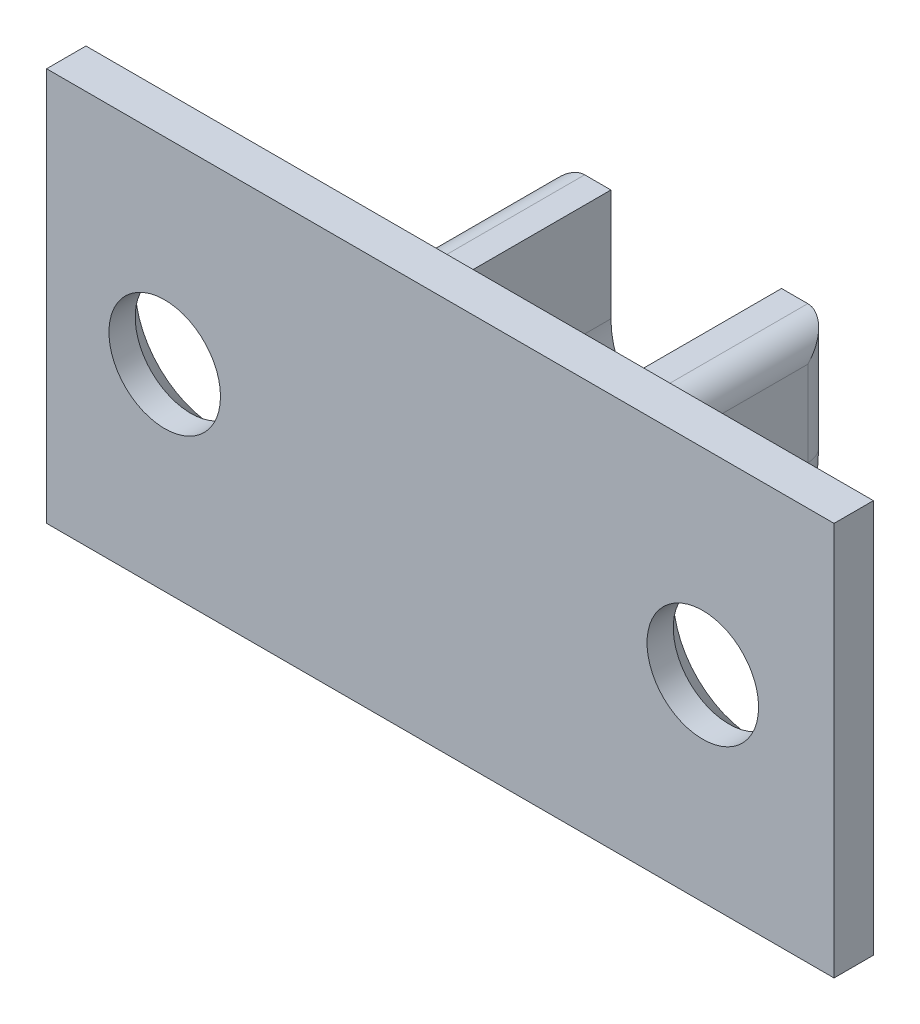
ISO-10303-21;
HEADER;
FILE_DESCRIPTION(('STEP AP214'),'2;1');
FILE_NAME('part.step','',(''),(''),'','','');
FILE_SCHEMA(('AUTOMOTIVE_DESIGN { 1 0 10303 214 1 1 1 1 }'));
ENDSEC;
DATA;
#1=APPLICATION_CONTEXT('core data for automotive mechanical design processes');
#2=APPLICATION_PROTOCOL_DEFINITION('international standard','automotive_design',2000,#1);
#3=PRODUCT_CONTEXT('',#1,'mechanical');
#4=PRODUCT('Part','Part','',(#3));
#5=PRODUCT_RELATED_PRODUCT_CATEGORY('part','',(#4));
#6=PRODUCT_DEFINITION_FORMATION('','',#4);
#7=PRODUCT_DEFINITION_CONTEXT('part definition',#1,'design');
#8=PRODUCT_DEFINITION('design','',#6,#7);
#9=PRODUCT_DEFINITION_SHAPE('','',#8);
#10=(LENGTH_UNIT() NAMED_UNIT(*) SI_UNIT(.MILLI.,.METRE.));
#11=(NAMED_UNIT(*) PLANE_ANGLE_UNIT() SI_UNIT($,.RADIAN.));
#12=(NAMED_UNIT(*) SI_UNIT($,.STERADIAN.) SOLID_ANGLE_UNIT());
#13=UNCERTAINTY_MEASURE_WITH_UNIT(LENGTH_MEASURE(1.E-05),#10,'distance_accuracy_value','');
#14=(GEOMETRIC_REPRESENTATION_CONTEXT(3) GLOBAL_UNCERTAINTY_ASSIGNED_CONTEXT((#13)) GLOBAL_UNIT_ASSIGNED_CONTEXT((#10,
#11,#12)) REPRESENTATION_CONTEXT('',''));
#15=CARTESIAN_POINT('',(0.,0.,0.));
#16=DIRECTION('',(0.,0.,1.));
#17=DIRECTION('',(1.,0.,0.));
#18=AXIS2_PLACEMENT_3D('',#15,#16,#17);
#19=CARTESIAN_POINT('',(0.,0.,0.));
#20=DIRECTION('',(0.,0.,1.));
#21=DIRECTION('',(1.,0.,0.));
#22=AXIS2_PLACEMENT_3D('',#19,#20,#21);
#23=PLANE('',#22);
#24=DIRECTION('',(-1.,0.,0.));
#25=VECTOR('',#24,1.);
#26=CARTESIAN_POINT('',(0.,0.500000000000004,0.));
#27=LINE('',#26,#25);
#28=CARTESIAN_POINT('',(30.,0.500000000000004,0.));
#29=VERTEX_POINT('',#28);
#30=CARTESIAN_POINT('',(0.500000000000004,0.500000000000004,0.));
#31=VERTEX_POINT('',#30);
#32=EDGE_CURVE('E383',#29,#31,#27,.T.);
#33=ORIENTED_EDGE('',*,*,#32,.T.);
#34=DIRECTION('',(0.,1.,0.));
#35=VECTOR('',#34,1.);
#36=CARTESIAN_POINT('',(0.500000000000004,15.,0.));
#37=LINE('',#36,#35);
#38=CARTESIAN_POINT('',(0.500000000000004,14.5,0.));
#39=VERTEX_POINT('',#38);
#40=EDGE_CURVE('E44',#31,#39,#37,.T.);
#41=ORIENTED_EDGE('',*,*,#40,.T.);
#42=DIRECTION('',(1.,0.,0.));
#43=VECTOR('',#42,1.);
#44=CARTESIAN_POINT('',(30.5,14.5,0.));
#45=LINE('',#44,#43);
#46=CARTESIAN_POINT('',(30.,14.5,0.));
#47=VERTEX_POINT('',#46);
#48=EDGE_CURVE('E60',#39,#47,#45,.T.);
#49=ORIENTED_EDGE('',*,*,#48,.T.);
#50=DIRECTION('',(0.,-1.,0.));
#51=VECTOR('',#50,1.);
#52=CARTESIAN_POINT('',(30.,0.,0.));
#53=LINE('',#52,#51);
#54=EDGE_CURVE('E385',#47,#29,#53,.T.);
#55=ORIENTED_EDGE('',*,*,#54,.T.);
#56=EDGE_LOOP('',(#33,#41,#49,#55));
#57=FACE_BOUND('',#56,.T.);
#58=CARTESIAN_POINT('',(5.,7.5,0.));
#59=DIRECTION('',(0.,0.,1.));
#60=DIRECTION('',(1.,0.,0.));
#61=AXIS2_PLACEMENT_3D('',#58,#59,#60);
#62=CIRCLE('',#61,3.12500000000001);
#63=CARTESIAN_POINT('',(8.12500000000001,7.5,0.));
#64=VERTEX_POINT('',#63);
#65=EDGE_CURVE('E354',#64,#64,#62,.T.);
#66=ORIENTED_EDGE('',*,*,#65,.T.);
#67=EDGE_LOOP('',(#66));
#68=FACE_BOUND('',#67,.T.);
#69=CARTESIAN_POINT('',(25.5,7.5,0.));
#70=DIRECTION('',(0.,0.,1.));
#71=DIRECTION('',(1.,0.,0.));
#72=AXIS2_PLACEMENT_3D('',#69,#70,#71);
#73=CIRCLE('',#72,3.12500000000002);
#74=CARTESIAN_POINT('',(28.625,7.5,0.));
#75=VERTEX_POINT('',#74);
#76=EDGE_CURVE('E318',#75,#75,#73,.T.);
#77=ORIENTED_EDGE('',*,*,#76,.T.);
#78=EDGE_LOOP('',(#77));
#79=FACE_BOUND('',#78,.T.);
#80=DIRECTION('',(1.,0.,0.));
#81=VECTOR('',#80,1.);
#82=CARTESIAN_POINT('',(18.5,12.75,0.));
#83=LINE('',#82,#81);
#84=CARTESIAN_POINT('',(19.5,12.75,0.));
#85=VERTEX_POINT('',#84);
#86=CARTESIAN_POINT('',(18.5,12.75,0.));
#87=VERTEX_POINT('',#86);
#88=EDGE_CURVE('E300',#85,#87,#83,.F.);
#89=ORIENTED_EDGE('',*,*,#88,.T.);
#90=DIRECTION('',(0.,1.,0.));
#91=VECTOR('',#90,1.);
#92=CARTESIAN_POINT('',(18.5,0.,0.));
#93=LINE('',#92,#91);
#94=CARTESIAN_POINT('',(18.5,7.5,0.));
#95=VERTEX_POINT('',#94);
#96=EDGE_CURVE('E233',#95,#87,#93,.T.);
#97=ORIENTED_EDGE('',*,*,#96,.F.);
#98=CARTESIAN_POINT('',(15.25,7.5,0.));
#99=DIRECTION('',(0.,0.,1.));
#100=DIRECTION('',(1.,0.,0.));
#101=AXIS2_PLACEMENT_3D('',#98,#99,#100);
#102=CIRCLE('',#101,3.25);
#103=CARTESIAN_POINT('',(12.,7.5,0.));
#104=VERTEX_POINT('',#103);
#105=EDGE_CURVE('E222',#104,#95,#102,.T.);
#106=ORIENTED_EDGE('',*,*,#105,.F.);
#107=DIRECTION('',(0.,1.,0.));
#108=VECTOR('',#107,1.);
#109=CARTESIAN_POINT('',(12.,0.,0.));
#110=LINE('',#109,#108);
#111=CARTESIAN_POINT('',(12.,12.75,0.));
#112=VERTEX_POINT('',#111);
#113=EDGE_CURVE('E220',#104,#112,#110,.T.);
#114=ORIENTED_EDGE('',*,*,#113,.T.);
#115=DIRECTION('',(-1.,0.,0.));
#116=VECTOR('',#115,1.);
#117=CARTESIAN_POINT('',(0.,12.75,0.));
#118=LINE('',#117,#116);
#119=CARTESIAN_POINT('',(11.,12.75,0.));
#120=VERTEX_POINT('',#119);
#121=EDGE_CURVE('E291',#112,#120,#118,.T.);
#122=ORIENTED_EDGE('',*,*,#121,.T.);
#123=CARTESIAN_POINT('',(11.,10.75,0.));
#124=DIRECTION('',(0.,0.,1.));
#125=DIRECTION('',(1.,0.,0.));
#126=AXIS2_PLACEMENT_3D('',#123,#124,#125);
#127=CIRCLE('',#126,2.);
#128=CARTESIAN_POINT('',(9.,10.75,0.));
#129=VERTEX_POINT('',#128);
#130=EDGE_CURVE('E288',#129,#120,#127,.F.);
#131=ORIENTED_EDGE('',*,*,#130,.F.);
#132=DIRECTION('',(0.,1.,0.));
#133=VECTOR('',#132,1.);
#134=CARTESIAN_POINT('',(9.,7.5,0.));
#135=LINE('',#134,#133);
#136=CARTESIAN_POINT('',(9.,7.5,0.));
#137=VERTEX_POINT('',#136);
#138=EDGE_CURVE('E286',#129,#137,#135,.F.);
#139=ORIENTED_EDGE('',*,*,#138,.T.);
#140=CARTESIAN_POINT('',(15.25,7.5,0.));
#141=DIRECTION('',(0.,0.,1.));
#142=DIRECTION('',(1.,0.,0.));
#143=AXIS2_PLACEMENT_3D('',#140,#141,#142);
#144=CIRCLE('',#143,6.25);
#145=CARTESIAN_POINT('',(21.5,7.5,0.));
#146=VERTEX_POINT('',#145);
#147=EDGE_CURVE('E293',#137,#146,#144,.T.);
#148=ORIENTED_EDGE('',*,*,#147,.T.);
#149=DIRECTION('',(0.,1.,0.));
#150=VECTOR('',#149,1.);
#151=CARTESIAN_POINT('',(21.5,0.,0.));
#152=LINE('',#151,#150);
#153=CARTESIAN_POINT('',(21.5,10.75,0.));
#154=VERTEX_POINT('',#153);
#155=EDGE_CURVE('E295',#146,#154,#152,.T.);
#156=ORIENTED_EDGE('',*,*,#155,.T.);
#157=CARTESIAN_POINT('',(19.5,10.75,0.));
#158=DIRECTION('',(0.,0.,1.));
#159=DIRECTION('',(1.,0.,0.));
#160=AXIS2_PLACEMENT_3D('',#157,#158,#159);
#161=CIRCLE('',#160,2.);
#162=EDGE_CURVE('E297',#85,#154,#161,.F.);
#163=ORIENTED_EDGE('',*,*,#162,.F.);
#164=EDGE_LOOP('',(#89,#97,#106,#114,#122,#131,#139,#148,#156,#163));
#165=FACE_BOUND('',#164,.T.);
#166=ADVANCED_FACE('F35',(#57,#68,#79,#165),#23,.F.);
#167=CARTESIAN_POINT('',(0.,0.,2.));
#168=DIRECTION('',(0.,1.,0.));
#169=DIRECTION('',(0.,0.,1.));
#170=AXIS2_PLACEMENT_3D('',#167,#168,#169);
#171=PLANE('',#170);
#172=DIRECTION('',(1.,0.,0.));
#173=VECTOR('',#172,1.);
#174=CARTESIAN_POINT('',(0.,0.,2.));
#175=LINE('',#174,#173);
#176=CARTESIAN_POINT('',(0.500000000000004,0.,2.));
#177=VERTEX_POINT('',#176);
#178=CARTESIAN_POINT('',(30.5,0.,2.));
#179=VERTEX_POINT('',#178);
#180=EDGE_CURVE('E240',#177,#179,#175,.T.);
#181=ORIENTED_EDGE('',*,*,#180,.F.);
#182=DIRECTION('',(0.,0.,-1.));
#183=VECTOR('',#182,1.);
#184=CARTESIAN_POINT('',(0.500000000000004,0.,0.));
#185=LINE('',#184,#183);
#186=CARTESIAN_POINT('',(0.500000000000004,0.,0.500000000000004));
#187=VERTEX_POINT('',#186);
#188=EDGE_CURVE('E381',#177,#187,#185,.T.);
#189=ORIENTED_EDGE('',*,*,#188,.T.);
#190=DIRECTION('',(1.,0.,0.));
#191=VECTOR('',#190,1.);
#192=CARTESIAN_POINT('',(0.,0.,0.500000000000004));
#193=LINE('',#192,#191);
#194=CARTESIAN_POINT('',(30.5,0.,0.500000000000004));
#195=VERTEX_POINT('',#194);
#196=EDGE_CURVE('E379',#187,#195,#193,.T.);
#197=ORIENTED_EDGE('',*,*,#196,.T.);
#198=DIRECTION('',(0.,0.,-1.));
#199=VECTOR('',#198,1.);
#200=CARTESIAN_POINT('',(30.5,0.,2.));
#201=LINE('',#200,#199);
#202=EDGE_CURVE('E263',#179,#195,#201,.T.);
#203=ORIENTED_EDGE('',*,*,#202,.F.);
#204=EDGE_LOOP('',(#181,#189,#197,#203));
#205=FACE_BOUND('',#204,.T.);
#206=ADVANCED_FACE('F453',(#205),#171,.F.);
#207=CARTESIAN_POINT('',(30.5,0.,2.));
#208=DIRECTION('',(-1.,0.,0.));
#209=DIRECTION('',(0.,0.,1.));
#210=AXIS2_PLACEMENT_3D('',#207,#208,#209);
#211=PLANE('',#210);
#212=ORIENTED_EDGE('',*,*,#202,.T.);
#213=DIRECTION('',(0.,1.,0.));
#214=VECTOR('',#213,1.);
#215=CARTESIAN_POINT('',(30.5,0.,0.500000000000004));
#216=LINE('',#215,#214);
#217=CARTESIAN_POINT('',(30.5,15.,0.500000000000004));
#218=VERTEX_POINT('',#217);
#219=EDGE_CURVE('E11',#195,#218,#216,.T.);
#220=ORIENTED_EDGE('',*,*,#219,.T.);
#221=DIRECTION('',(0.,0.,-1.));
#222=VECTOR('',#221,1.);
#223=CARTESIAN_POINT('',(30.5,15.,2.));
#224=LINE('',#223,#222);
#225=CARTESIAN_POINT('',(30.5,15.,2.));
#226=VERTEX_POINT('',#225);
#227=EDGE_CURVE('E260',#226,#218,#224,.T.);
#228=ORIENTED_EDGE('',*,*,#227,.F.);
#229=DIRECTION('',(0.,1.,0.));
#230=VECTOR('',#229,1.);
#231=CARTESIAN_POINT('',(30.5,0.,2.));
#232=LINE('',#231,#230);
#233=EDGE_CURVE('E249',#179,#226,#232,.T.);
#234=ORIENTED_EDGE('',*,*,#233,.F.);
#235=EDGE_LOOP('',(#212,#220,#228,#234));
#236=FACE_BOUND('',#235,.T.);
#237=ADVANCED_FACE('F441',(#236),#211,.F.);
#238=CARTESIAN_POINT('',(0.,15.,2.));
#239=DIRECTION('',(0.,1.,0.));
#240=DIRECTION('',(0.,0.,1.));
#241=AXIS2_PLACEMENT_3D('',#238,#239,#240);
#242=PLANE('',#241);
#243=DIRECTION('',(-1.,0.,0.));
#244=VECTOR('',#243,1.);
#245=CARTESIAN_POINT('',(0.,15.,0.500000000000004));
#246=LINE('',#245,#244);
#247=CARTESIAN_POINT('',(0.500000000000004,15.,0.500000000000004));
#248=VERTEX_POINT('',#247);
#249=EDGE_CURVE('E372',#218,#248,#246,.T.);
#250=ORIENTED_EDGE('',*,*,#249,.T.);
#251=DIRECTION('',(0.,0.,1.));
#252=VECTOR('',#251,1.);
#253=CARTESIAN_POINT('',(0.500000000000004,15.,2.));
#254=LINE('',#253,#252);
#255=CARTESIAN_POINT('',(0.500000000000004,15.,2.));
#256=VERTEX_POINT('',#255);
#257=EDGE_CURVE('E374',#248,#256,#254,.T.);
#258=ORIENTED_EDGE('',*,*,#257,.T.);
#259=DIRECTION('',(1.,0.,0.));
#260=VECTOR('',#259,1.);
#261=CARTESIAN_POINT('',(0.,15.,2.));
#262=LINE('',#261,#260);
#263=EDGE_CURVE('E252',#256,#226,#262,.T.);
#264=ORIENTED_EDGE('',*,*,#263,.T.);
#265=ORIENTED_EDGE('',*,*,#227,.T.);
#266=EDGE_LOOP('',(#250,#258,#264,#265));
#267=FACE_BOUND('',#266,.T.);
#268=ADVANCED_FACE('F445',(#267),#242,.T.);
#269=CARTESIAN_POINT('',(5.,7.5,2.));
#270=DIRECTION('',(0.,0.,-1.));
#271=DIRECTION('',(-1.,0.,0.));
#272=AXIS2_PLACEMENT_3D('',#269,#270,#271);
#273=CYLINDRICAL_SURFACE('',#272,2.125);
#274=CARTESIAN_POINT('',(5.,7.5,1.00000000000001));
#275=DIRECTION('',(0.,0.,1.));
#276=DIRECTION('',(1.,0.,0.));
#277=AXIS2_PLACEMENT_3D('',#274,#275,#276);
#278=CIRCLE('',#277,2.125);
#279=CARTESIAN_POINT('',(7.125,7.5,1.00000000000001));
#280=VERTEX_POINT('',#279);
#281=EDGE_CURVE('E357',#280,#280,#278,.F.);
#282=ORIENTED_EDGE('',*,*,#281,.T.);
#283=EDGE_LOOP('',(#282));
#284=FACE_BOUND('',#283,.T.);
#285=CARTESIAN_POINT('',(5.,7.5,2.));
#286=DIRECTION('',(0.,0.,1.));
#287=DIRECTION('',(1.,0.,0.));
#288=AXIS2_PLACEMENT_3D('',#285,#286,#287);
#289=CIRCLE('',#288,2.125);
#290=CARTESIAN_POINT('',(7.125,7.5,2.));
#291=VERTEX_POINT('',#290);
#292=EDGE_CURVE('E254',#291,#291,#289,.T.);
#293=ORIENTED_EDGE('',*,*,#292,.T.);
#294=EDGE_LOOP('',(#293));
#295=FACE_BOUND('',#294,.T.);
#296=ADVANCED_FACE('F690',(#284,#295),#273,.F.);
#297=CARTESIAN_POINT('',(0.,0.,2.));
#298=DIRECTION('',(-1.,0.,0.));
#299=DIRECTION('',(0.,0.,1.));
#300=AXIS2_PLACEMENT_3D('',#297,#298,#299);
#301=PLANE('',#300);
#302=DIRECTION('',(0.,1.,0.));
#303=VECTOR('',#302,1.);
#304=CARTESIAN_POINT('',(0.,0.,1.5));
#305=LINE('',#304,#303);
#306=CARTESIAN_POINT('',(0.,0.500000000000004,1.5));
#307=VERTEX_POINT('',#306);
#308=CARTESIAN_POINT('',(0.,14.5,1.5));
#309=VERTEX_POINT('',#308);
#310=EDGE_CURVE('E367',#307,#309,#305,.T.);
#311=ORIENTED_EDGE('',*,*,#310,.T.);
#312=DIRECTION('',(0.,0.,-1.));
#313=VECTOR('',#312,1.);
#314=CARTESIAN_POINT('',(0.,14.5,2.));
#315=LINE('',#314,#313);
#316=CARTESIAN_POINT('',(0.,14.5,0.500000000000004));
#317=VERTEX_POINT('',#316);
#318=EDGE_CURVE('E369',#309,#317,#315,.T.);
#319=ORIENTED_EDGE('',*,*,#318,.T.);
#320=DIRECTION('',(0.,-1.,0.));
#321=VECTOR('',#320,1.);
#322=CARTESIAN_POINT('',(0.,0.,0.500000000000004));
#323=LINE('',#322,#321);
#324=CARTESIAN_POINT('',(0.,0.500000000000004,0.500000000000004));
#325=VERTEX_POINT('',#324);
#326=EDGE_CURVE('E363',#317,#325,#323,.T.);
#327=ORIENTED_EDGE('',*,*,#326,.T.);
#328=DIRECTION('',(0.,0.,1.));
#329=VECTOR('',#328,1.);
#330=CARTESIAN_POINT('',(0.,0.500000000000004,2.));
#331=LINE('',#330,#329);
#332=EDGE_CURVE('E365',#325,#307,#331,.T.);
#333=ORIENTED_EDGE('',*,*,#332,.T.);
#334=EDGE_LOOP('',(#311,#319,#327,#333));
#335=FACE_BOUND('',#334,.T.);
#336=ADVANCED_FACE('F429',(#335),#301,.T.);
#337=CARTESIAN_POINT('',(25.5,7.5,2.));
#338=DIRECTION('',(0.,0.,-1.));
#339=DIRECTION('',(-1.,0.,0.));
#340=AXIS2_PLACEMENT_3D('',#337,#338,#339);
#341=CYLINDRICAL_SURFACE('',#340,2.125);
#342=CARTESIAN_POINT('',(25.5,7.5,1.00000000000001));
#343=DIRECTION('',(0.,0.,1.));
#344=DIRECTION('',(1.,0.,0.));
#345=AXIS2_PLACEMENT_3D('',#342,#343,#344);
#346=CIRCLE('',#345,2.125);
#347=CARTESIAN_POINT('',(27.625,7.5,1.00000000000001));
#348=VERTEX_POINT('',#347);
#349=EDGE_CURVE('E360',#348,#348,#346,.F.);
#350=ORIENTED_EDGE('',*,*,#349,.T.);
#351=EDGE_LOOP('',(#350));
#352=FACE_BOUND('',#351,.T.);
#353=CARTESIAN_POINT('',(25.5,7.5,2.));
#354=DIRECTION('',(0.,0.,1.));
#355=DIRECTION('',(1.,0.,0.));
#356=AXIS2_PLACEMENT_3D('',#353,#354,#355);
#357=CIRCLE('',#356,2.125);
#358=CARTESIAN_POINT('',(27.625,7.5,2.));
#359=VERTEX_POINT('',#358);
#360=EDGE_CURVE('E257',#359,#359,#357,.F.);
#361=ORIENTED_EDGE('',*,*,#360,.F.);
#362=EDGE_LOOP('',(#361));
#363=FACE_BOUND('',#362,.T.);
#364=ADVANCED_FACE('F677',(#352,#363),#341,.F.);
#365=CARTESIAN_POINT('',(0.,0.,2.));
#366=DIRECTION('',(0.,0.,1.));
#367=DIRECTION('',(1.,0.,0.));
#368=AXIS2_PLACEMENT_3D('',#365,#366,#367);
#369=PLANE('',#368);
#370=ORIENTED_EDGE('',*,*,#263,.F.);
#371=DIRECTION('',(0.,-1.,0.));
#372=VECTOR('',#371,1.);
#373=CARTESIAN_POINT('',(0.500000000000004,0.,2.));
#374=LINE('',#373,#372);
#375=EDGE_CURVE('E377',#256,#177,#374,.T.);
#376=ORIENTED_EDGE('',*,*,#375,.T.);
#377=ORIENTED_EDGE('',*,*,#180,.T.);
#378=ORIENTED_EDGE('',*,*,#233,.T.);
#379=EDGE_LOOP('',(#370,#376,#377,#378));
#380=FACE_BOUND('',#379,.T.);
#381=ORIENTED_EDGE('',*,*,#292,.F.);
#382=EDGE_LOOP('',(#381));
#383=FACE_BOUND('',#382,.T.);
#384=ORIENTED_EDGE('',*,*,#360,.T.);
#385=EDGE_LOOP('',(#384));
#386=FACE_BOUND('',#385,.T.);
#387=ADVANCED_FACE('F449',(#380,#383,#386),#369,.T.);
#388=CARTESIAN_POINT('',(10.,0.,-8.));
#389=DIRECTION('',(1.,0.,0.));
#390=DIRECTION('',(0.,0.,-1.));
#391=AXIS2_PLACEMENT_3D('',#388,#389,#390);
#392=PLANE('',#391);
#393=DIRECTION('',(0.,0.,1.));
#394=VECTOR('',#393,1.);
#395=CARTESIAN_POINT('',(10.,10.75,-8.));
#396=LINE('',#395,#394);
#397=CARTESIAN_POINT('',(10.,10.75,-1.));
#398=VERTEX_POINT('',#397);
#399=CARTESIAN_POINT('',(10.,10.75,-7.));
#400=VERTEX_POINT('',#399);
#401=EDGE_CURVE('E275',#398,#400,#396,.F.);
#402=ORIENTED_EDGE('',*,*,#401,.T.);
#403=DIRECTION('',(0.,1.,0.));
#404=VECTOR('',#403,1.);
#405=CARTESIAN_POINT('',(10.,0.,-7.));
#406=LINE('',#405,#404);
#407=CARTESIAN_POINT('',(10.,7.5,-7.));
#408=VERTEX_POINT('',#407);
#409=EDGE_CURVE('E277',#400,#408,#406,.F.);
#410=ORIENTED_EDGE('',*,*,#409,.T.);
#411=DIRECTION('',(0.,0.,1.));
#412=VECTOR('',#411,1.);
#413=CARTESIAN_POINT('',(10.,7.5,-8.));
#414=LINE('',#413,#412);
#415=CARTESIAN_POINT('',(10.,7.5,-1.));
#416=VERTEX_POINT('',#415);
#417=EDGE_CURVE('E232',#408,#416,#414,.T.);
#418=ORIENTED_EDGE('',*,*,#417,.T.);
#419=DIRECTION('',(0.,1.,0.));
#420=VECTOR('',#419,1.);
#421=CARTESIAN_POINT('',(10.,11.75,-1.));
#422=LINE('',#421,#420);
#423=EDGE_CURVE('E273',#416,#398,#422,.T.);
#424=ORIENTED_EDGE('',*,*,#423,.T.);
#425=EDGE_LOOP('',(#402,#410,#418,#424));
#426=FACE_BOUND('',#425,.T.);
#427=ADVANCED_FACE('F664',(#426),#392,.F.);
#428=CARTESIAN_POINT('',(0.,11.75,-8.));
#429=DIRECTION('',(0.,1.,0.));
#430=DIRECTION('',(0.,0.,1.));
#431=AXIS2_PLACEMENT_3D('',#428,#429,#430);
#432=PLANE('',#431);
#433=DIRECTION('',(-1.,0.,0.));
#434=VECTOR('',#433,1.);
#435=CARTESIAN_POINT('',(0.,11.75,-8.));
#436=LINE('',#435,#434);
#437=CARTESIAN_POINT('',(12.,11.75,-8.));
#438=VERTEX_POINT('',#437);
#439=CARTESIAN_POINT('',(11.,11.75,-8.));
#440=VERTEX_POINT('',#439);
#441=EDGE_CURVE('E229',#438,#440,#436,.T.);
#442=ORIENTED_EDGE('',*,*,#441,.T.);
#443=DIRECTION('',(0.,0.,1.));
#444=VECTOR('',#443,1.);
#445=CARTESIAN_POINT('',(11.,11.75,0.));
#446=LINE('',#445,#444);
#447=CARTESIAN_POINT('',(11.,11.75,-1.));
#448=VERTEX_POINT('',#447);
#449=EDGE_CURVE('E312',#440,#448,#446,.T.);
#450=ORIENTED_EDGE('',*,*,#449,.T.);
#451=DIRECTION('',(-1.,0.,0.));
#452=VECTOR('',#451,1.);
#453=CARTESIAN_POINT('',(0.,11.75,-1.));
#454=LINE('',#453,#452);
#455=CARTESIAN_POINT('',(12.,11.75,-1.));
#456=VERTEX_POINT('',#455);
#457=EDGE_CURVE('E310',#448,#456,#454,.F.);
#458=ORIENTED_EDGE('',*,*,#457,.T.);
#459=DIRECTION('',(0.,0.,1.));
#460=VECTOR('',#459,1.);
#461=CARTESIAN_POINT('',(12.,11.75,-8.));
#462=LINE('',#461,#460);
#463=EDGE_CURVE('E237',#438,#456,#462,.T.);
#464=ORIENTED_EDGE('',*,*,#463,.F.);
#465=EDGE_LOOP('',(#442,#450,#458,#464));
#466=FACE_BOUND('',#465,.T.);
#467=ADVANCED_FACE('F656',(#466),#432,.T.);
#468=CARTESIAN_POINT('',(12.,0.,-8.));
#469=DIRECTION('',(1.,0.,0.));
#470=DIRECTION('',(0.,0.,-1.));
#471=AXIS2_PLACEMENT_3D('',#468,#469,#470);
#472=PLANE('',#471);
#473=ORIENTED_EDGE('',*,*,#113,.F.);
#474=DIRECTION('',(0.,0.,1.));
#475=VECTOR('',#474,1.);
#476=CARTESIAN_POINT('',(12.,7.5,-8.));
#477=LINE('',#476,#475);
#478=CARTESIAN_POINT('',(12.,7.5,-8.));
#479=VERTEX_POINT('',#478);
#480=EDGE_CURVE('E241',#479,#104,#477,.T.);
#481=ORIENTED_EDGE('',*,*,#480,.F.);
#482=DIRECTION('',(0.,1.,0.));
#483=VECTOR('',#482,1.);
#484=CARTESIAN_POINT('',(12.,0.,-8.));
#485=LINE('',#484,#483);
#486=EDGE_CURVE('E226',#479,#438,#485,.T.);
#487=ORIENTED_EDGE('',*,*,#486,.T.);
#488=ORIENTED_EDGE('',*,*,#463,.T.);
#489=CARTESIAN_POINT('',(12.,12.75,-1.));
#490=DIRECTION('',(1.,0.,0.));
#491=DIRECTION('',(0.,0.,-1.));
#492=AXIS2_PLACEMENT_3D('',#489,#490,#491);
#493=CIRCLE('',#492,1.);
#494=EDGE_CURVE('E314',#456,#112,#493,.F.);
#495=ORIENTED_EDGE('',*,*,#494,.T.);
#496=EDGE_LOOP('',(#473,#481,#487,#488,#495));
#497=FACE_BOUND('',#496,.T.);
#498=ADVANCED_FACE('F648',(#497),#472,.T.);
#499=CARTESIAN_POINT('',(15.25,7.5,-8.));
#500=DIRECTION('',(0.,0.,1.));
#501=DIRECTION('',(1.,0.,0.));
#502=AXIS2_PLACEMENT_3D('',#499,#500,#501);
#503=CYLINDRICAL_SURFACE('',#502,3.25);
#504=ORIENTED_EDGE('',*,*,#105,.T.);
#505=DIRECTION('',(0.,0.,1.));
#506=VECTOR('',#505,1.);
#507=CARTESIAN_POINT('',(18.5,7.5,-8.));
#508=LINE('',#507,#506);
#509=CARTESIAN_POINT('',(18.5,7.5,-8.));
#510=VERTEX_POINT('',#509);
#511=EDGE_CURVE('E214',#510,#95,#508,.T.);
#512=ORIENTED_EDGE('',*,*,#511,.F.);
#513=CARTESIAN_POINT('',(15.25,7.5,-8.));
#514=DIRECTION('',(0.,0.,1.));
#515=DIRECTION('',(1.,0.,0.));
#516=AXIS2_PLACEMENT_3D('',#513,#514,#515);
#517=CIRCLE('',#516,3.25);
#518=EDGE_CURVE('E202',#479,#510,#517,.T.);
#519=ORIENTED_EDGE('',*,*,#518,.F.);
#520=ORIENTED_EDGE('',*,*,#480,.T.);
#521=EDGE_LOOP('',(#504,#512,#519,#520));
#522=FACE_BOUND('',#521,.T.);
#523=ADVANCED_FACE('F640',(#522),#503,.F.);
#524=CARTESIAN_POINT('',(18.5,0.,-8.));
#525=DIRECTION('',(1.,0.,0.));
#526=DIRECTION('',(0.,0.,-1.));
#527=AXIS2_PLACEMENT_3D('',#524,#525,#526);
#528=PLANE('',#527);
#529=ORIENTED_EDGE('',*,*,#96,.T.);
#530=CARTESIAN_POINT('',(18.5,12.75,-1.));
#531=DIRECTION('',(1.,0.,0.));
#532=DIRECTION('',(0.,0.,-1.));
#533=AXIS2_PLACEMENT_3D('',#530,#531,#532);
#534=CIRCLE('',#533,1.);
#535=CARTESIAN_POINT('',(18.5,11.75,-1.));
#536=VERTEX_POINT('',#535);
#537=EDGE_CURVE('E211',#87,#536,#534,.T.);
#538=ORIENTED_EDGE('',*,*,#537,.T.);
#539=DIRECTION('',(0.,0.,1.));
#540=VECTOR('',#539,1.);
#541=CARTESIAN_POINT('',(18.5,11.75,-8.));
#542=LINE('',#541,#540);
#543=CARTESIAN_POINT('',(18.5,11.75,-8.));
#544=VERTEX_POINT('',#543);
#545=EDGE_CURVE('E208',#544,#536,#542,.T.);
#546=ORIENTED_EDGE('',*,*,#545,.F.);
#547=DIRECTION('',(0.,1.,0.));
#548=VECTOR('',#547,1.);
#549=CARTESIAN_POINT('',(18.5,0.,-8.));
#550=LINE('',#549,#548);
#551=EDGE_CURVE('E194',#510,#544,#550,.T.);
#552=ORIENTED_EDGE('',*,*,#551,.F.);
#553=ORIENTED_EDGE('',*,*,#511,.T.);
#554=EDGE_LOOP('',(#529,#538,#546,#552,#553));
#555=FACE_BOUND('',#554,.T.);
#556=ADVANCED_FACE('F209',(#555),#528,.F.);
#557=CARTESIAN_POINT('',(0.,11.75,-8.));
#558=DIRECTION('',(0.,-1.,0.));
#559=DIRECTION('',(0.,0.,-1.));
#560=AXIS2_PLACEMENT_3D('',#557,#558,#559);
#561=PLANE('',#560);
#562=DIRECTION('',(1.,0.,0.));
#563=VECTOR('',#562,1.);
#564=CARTESIAN_POINT('',(20.5,11.75,-1.));
#565=LINE('',#564,#563);
#566=CARTESIAN_POINT('',(19.5,11.75,-1.));
#567=VERTEX_POINT('',#566);
#568=EDGE_CURVE('E307',#536,#567,#565,.T.);
#569=ORIENTED_EDGE('',*,*,#568,.T.);
#570=DIRECTION('',(0.,0.,1.));
#571=VECTOR('',#570,1.);
#572=CARTESIAN_POINT('',(19.5,11.75,-8.));
#573=LINE('',#572,#571);
#574=CARTESIAN_POINT('',(19.5,11.75,-8.));
#575=VERTEX_POINT('',#574);
#576=EDGE_CURVE('E219',#567,#575,#573,.F.);
#577=ORIENTED_EDGE('',*,*,#576,.T.);
#578=DIRECTION('',(1.,0.,0.));
#579=VECTOR('',#578,1.);
#580=CARTESIAN_POINT('',(0.,11.75,-8.));
#581=LINE('',#580,#579);
#582=EDGE_CURVE('E198',#544,#575,#581,.T.);
#583=ORIENTED_EDGE('',*,*,#582,.F.);
#584=ORIENTED_EDGE('',*,*,#545,.T.);
#585=EDGE_LOOP('',(#569,#577,#583,#584));
#586=FACE_BOUND('',#585,.T.);
#587=ADVANCED_FACE('F217',(#586),#561,.F.);
#588=CARTESIAN_POINT('',(20.5,0.,-8.));
#589=DIRECTION('',(1.,0.,0.));
#590=DIRECTION('',(0.,0.,-1.));
#591=AXIS2_PLACEMENT_3D('',#588,#589,#590);
#592=PLANE('',#591);
#593=DIRECTION('',(0.,0.,1.));
#594=VECTOR('',#593,1.);
#595=CARTESIAN_POINT('',(20.5,7.5,-8.));
#596=LINE('',#595,#594);
#597=CARTESIAN_POINT('',(20.5,7.5,-7.));
#598=VERTEX_POINT('',#597);
#599=CARTESIAN_POINT('',(20.5,7.5,-1.));
#600=VERTEX_POINT('',#599);
#601=EDGE_CURVE('E215',#598,#600,#596,.T.);
#602=ORIENTED_EDGE('',*,*,#601,.F.);
#603=DIRECTION('',(0.,1.,0.));
#604=VECTOR('',#603,1.);
#605=CARTESIAN_POINT('',(20.5,11.75,-7.));
#606=LINE('',#605,#604);
#607=CARTESIAN_POINT('',(20.5,10.75,-7.));
#608=VERTEX_POINT('',#607);
#609=EDGE_CURVE('E284',#598,#608,#606,.T.);
#610=ORIENTED_EDGE('',*,*,#609,.T.);
#611=DIRECTION('',(0.,0.,1.));
#612=VECTOR('',#611,1.);
#613=CARTESIAN_POINT('',(20.5,10.75,0.));
#614=LINE('',#613,#612);
#615=CARTESIAN_POINT('',(20.5,10.75,-1.));
#616=VERTEX_POINT('',#615);
#617=EDGE_CURVE('E280',#608,#616,#614,.T.);
#618=ORIENTED_EDGE('',*,*,#617,.T.);
#619=DIRECTION('',(0.,1.,0.));
#620=VECTOR('',#619,1.);
#621=CARTESIAN_POINT('',(20.5,0.,-1.));
#622=LINE('',#621,#620);
#623=EDGE_CURVE('E282',#616,#600,#622,.F.);
#624=ORIENTED_EDGE('',*,*,#623,.T.);
#625=EDGE_LOOP('',(#602,#610,#618,#624));
#626=FACE_BOUND('',#625,.T.);
#627=ADVANCED_FACE('F619',(#626),#592,.T.);
#628=CARTESIAN_POINT('',(15.25,7.5,-8.));
#629=DIRECTION('',(0.,0.,1.));
#630=DIRECTION('',(1.,0.,0.));
#631=AXIS2_PLACEMENT_3D('',#628,#629,#630);
#632=CYLINDRICAL_SURFACE('',#631,5.25);
#633=ORIENTED_EDGE('',*,*,#601,.T.);
#634=CARTESIAN_POINT('',(15.25,7.5,-1.));
#635=DIRECTION('',(0.,0.,1.));
#636=DIRECTION('',(1.,0.,0.));
#637=AXIS2_PLACEMENT_3D('',#634,#635,#636);
#638=CIRCLE('',#637,5.25);
#639=EDGE_CURVE('E305',#600,#416,#638,.F.);
#640=ORIENTED_EDGE('',*,*,#639,.T.);
#641=ORIENTED_EDGE('',*,*,#417,.F.);
#642=CARTESIAN_POINT('',(15.25,7.5,-7.));
#643=DIRECTION('',(0.,0.,1.));
#644=DIRECTION('',(1.,0.,0.));
#645=AXIS2_PLACEMENT_3D('',#642,#643,#644);
#646=CIRCLE('',#645,5.25);
#647=EDGE_CURVE('E303',#408,#598,#646,.T.);
#648=ORIENTED_EDGE('',*,*,#647,.T.);
#649=EDGE_LOOP('',(#633,#640,#641,#648));
#650=FACE_BOUND('',#649,.T.);
#651=ADVANCED_FACE('F612',(#650),#632,.T.);
#652=CARTESIAN_POINT('',(0.,0.,-8.));
#653=DIRECTION('',(0.,0.,1.));
#654=DIRECTION('',(1.,0.,0.));
#655=AXIS2_PLACEMENT_3D('',#652,#653,#654);
#656=PLANE('',#655);
#657=CARTESIAN_POINT('',(15.25,7.5,-8.));
#658=DIRECTION('',(0.,0.,1.));
#659=DIRECTION('',(1.,0.,0.));
#660=AXIS2_PLACEMENT_3D('',#657,#658,#659);
#661=CIRCLE('',#660,4.25);
#662=CARTESIAN_POINT('',(19.5,7.5,-8.));
#663=VERTEX_POINT('',#662);
#664=CARTESIAN_POINT('',(11.,7.5,-8.));
#665=VERTEX_POINT('',#664);
#666=EDGE_CURVE('E266',#663,#665,#661,.F.);
#667=ORIENTED_EDGE('',*,*,#666,.T.);
#668=DIRECTION('',(0.,1.,0.));
#669=VECTOR('',#668,1.);
#670=CARTESIAN_POINT('',(11.,0.,-8.));
#671=LINE('',#670,#669);
#672=EDGE_CURVE('E270',#665,#440,#671,.T.);
#673=ORIENTED_EDGE('',*,*,#672,.T.);
#674=ORIENTED_EDGE('',*,*,#441,.F.);
#675=ORIENTED_EDGE('',*,*,#486,.F.);
#676=ORIENTED_EDGE('',*,*,#518,.T.);
#677=ORIENTED_EDGE('',*,*,#551,.T.);
#678=ORIENTED_EDGE('',*,*,#582,.T.);
#679=DIRECTION('',(0.,1.,0.));
#680=VECTOR('',#679,1.);
#681=CARTESIAN_POINT('',(19.5,7.5,-8.));
#682=LINE('',#681,#680);
#683=EDGE_CURVE('E268',#575,#663,#682,.F.);
#684=ORIENTED_EDGE('',*,*,#683,.T.);
#685=EDGE_LOOP('',(#667,#673,#674,#675,#676,#677,#678,#684));
#686=FACE_BOUND('',#685,.T.);
#687=ADVANCED_FACE('F196',(#686),#656,.F.);
#688=CARTESIAN_POINT('',(0.,12.75,-1.));
#689=DIRECTION('',(-1.,0.,0.));
#690=DIRECTION('',(0.,0.,1.));
#691=AXIS2_PLACEMENT_3D('',#688,#689,#690);
#692=CYLINDRICAL_SURFACE('',#691,1.);
#693=ORIENTED_EDGE('',*,*,#537,.F.);
#694=ORIENTED_EDGE('',*,*,#88,.F.);
#695=CARTESIAN_POINT('',(19.5,12.75,-1.));
#696=DIRECTION('',(-1.,0.,0.));
#697=DIRECTION('',(0.,0.,1.));
#698=AXIS2_PLACEMENT_3D('',#695,#696,#697);
#699=CIRCLE('',#698,1.);
#700=EDGE_CURVE('E347',#567,#85,#699,.T.);
#701=ORIENTED_EDGE('',*,*,#700,.F.);
#702=ORIENTED_EDGE('',*,*,#568,.F.);
#703=EDGE_LOOP('',(#693,#694,#701,#702));
#704=FACE_BOUND('',#703,.T.);
#705=ADVANCED_FACE('F508',(#704),#692,.F.);
#706=CARTESIAN_POINT('',(21.5,0.,-1.));
#707=DIRECTION('',(0.,1.,0.));
#708=DIRECTION('',(0.,0.,1.));
#709=AXIS2_PLACEMENT_3D('',#706,#707,#708);
#710=CYLINDRICAL_SURFACE('',#709,1.);
#711=CARTESIAN_POINT('',(21.5,10.75,-1.));
#712=DIRECTION('',(0.,-1.,0.));
#713=DIRECTION('',(0.,0.,-1.));
#714=AXIS2_PLACEMENT_3D('',#711,#712,#713);
#715=CIRCLE('',#714,1.);
#716=EDGE_CURVE('E235',#154,#616,#715,.T.);
#717=ORIENTED_EDGE('',*,*,#716,.F.);
#718=ORIENTED_EDGE('',*,*,#155,.F.);
#719=CARTESIAN_POINT('',(21.5,7.5,-1.));
#720=DIRECTION('',(0.,1.,0.));
#721=DIRECTION('',(0.,0.,1.));
#722=AXIS2_PLACEMENT_3D('',#719,#720,#721);
#723=CIRCLE('',#722,1.);
#724=EDGE_CURVE('E344',#600,#146,#723,.T.);
#725=ORIENTED_EDGE('',*,*,#724,.F.);
#726=ORIENTED_EDGE('',*,*,#623,.F.);
#727=EDGE_LOOP('',(#717,#718,#725,#726));
#728=FACE_BOUND('',#727,.T.);
#729=ADVANCED_FACE('F504',(#728),#710,.F.);
#730=CARTESIAN_POINT('',(19.5,10.75,-1.));
#731=DIRECTION('',(0.,0.,1.));
#732=DIRECTION('',(1.,0.,0.));
#733=AXIS2_PLACEMENT_3D('',#730,#731,#732);
#734=TOROIDAL_SURFACE('',#733,2.,1.);
#735=ORIENTED_EDGE('',*,*,#162,.T.);
#736=ORIENTED_EDGE('',*,*,#716,.T.);
#737=CARTESIAN_POINT('',(19.5,10.75,-1.));
#738=DIRECTION('',(0.,0.,1.));
#739=DIRECTION('',(1.,0.,0.));
#740=AXIS2_PLACEMENT_3D('',#737,#738,#739);
#741=CIRCLE('',#740,1.);
#742=EDGE_CURVE('E341',#567,#616,#741,.F.);
#743=ORIENTED_EDGE('',*,*,#742,.F.);
#744=ORIENTED_EDGE('',*,*,#700,.T.);
#745=EDGE_LOOP('',(#735,#736,#743,#744));
#746=FACE_BOUND('',#745,.T.);
#747=ADVANCED_FACE('F500',(#746),#734,.F.);
#748=CARTESIAN_POINT('',(15.25,7.5,-1.));
#749=DIRECTION('',(0.,0.,1.));
#750=DIRECTION('',(1.,0.,0.));
#751=AXIS2_PLACEMENT_3D('',#748,#749,#750);
#752=TOROIDAL_SURFACE('',#751,6.25,1.);
#753=ORIENTED_EDGE('',*,*,#724,.T.);
#754=ORIENTED_EDGE('',*,*,#147,.F.);
#755=CARTESIAN_POINT('',(9.,7.5,-1.));
#756=DIRECTION('',(0.,-1.,0.));
#757=DIRECTION('',(0.,0.,-1.));
#758=AXIS2_PLACEMENT_3D('',#755,#756,#757);
#759=CIRCLE('',#758,1.);
#760=EDGE_CURVE('E338',#416,#137,#759,.T.);
#761=ORIENTED_EDGE('',*,*,#760,.F.);
#762=ORIENTED_EDGE('',*,*,#639,.F.);
#763=EDGE_LOOP('',(#753,#754,#761,#762));
#764=FACE_BOUND('',#763,.T.);
#765=ADVANCED_FACE('F496',(#764),#752,.F.);
#766=CARTESIAN_POINT('',(19.5,10.75,-8.));
#767=DIRECTION('',(0.,0.,-1.));
#768=DIRECTION('',(-1.,0.,0.));
#769=AXIS2_PLACEMENT_3D('',#766,#767,#768);
#770=CYLINDRICAL_SURFACE('',#769,1.);
#771=ORIENTED_EDGE('',*,*,#742,.T.);
#772=ORIENTED_EDGE('',*,*,#617,.F.);
#773=CARTESIAN_POINT('',(19.5,10.75,-7.));
#774=DIRECTION('',(0.,-0.707106781186547,-0.707106781186547));
#775=DIRECTION('',(0.,0.707106781186547,-0.707106781186547));
#776=AXIS2_PLACEMENT_3D('',#773,#774,#775);
#777=ELLIPSE('',#776,1.41421356237309,1.);
#778=EDGE_CURVE('E335',#575,#608,#777,.T.);
#779=ORIENTED_EDGE('',*,*,#778,.F.);
#780=ORIENTED_EDGE('',*,*,#576,.F.);
#781=EDGE_LOOP('',(#771,#772,#779,#780));
#782=FACE_BOUND('',#781,.T.);
#783=ADVANCED_FACE('F492',(#782),#770,.T.);
#784=CARTESIAN_POINT('',(0.,12.75,-1.));
#785=DIRECTION('',(-1.,0.,0.));
#786=DIRECTION('',(0.,0.,1.));
#787=AXIS2_PLACEMENT_3D('',#784,#785,#786);
#788=CYLINDRICAL_SURFACE('',#787,1.);
#789=ORIENTED_EDGE('',*,*,#494,.F.);
#790=ORIENTED_EDGE('',*,*,#457,.F.);
#791=CARTESIAN_POINT('',(11.,12.75,-1.));
#792=DIRECTION('',(1.,0.,0.));
#793=DIRECTION('',(0.,0.,-1.));
#794=AXIS2_PLACEMENT_3D('',#791,#792,#793);
#795=CIRCLE('',#794,1.);
#796=EDGE_CURVE('E332',#120,#448,#795,.T.);
#797=ORIENTED_EDGE('',*,*,#796,.F.);
#798=ORIENTED_EDGE('',*,*,#121,.F.);
#799=EDGE_LOOP('',(#789,#790,#797,#798));
#800=FACE_BOUND('',#799,.T.);
#801=ADVANCED_FACE('F488',(#800),#788,.F.);
#802=CARTESIAN_POINT('',(9.,0.,-1.));
#803=DIRECTION('',(0.,-1.,0.));
#804=DIRECTION('',(0.,0.,-1.));
#805=AXIS2_PLACEMENT_3D('',#802,#803,#804);
#806=CYLINDRICAL_SURFACE('',#805,1.);
#807=ORIENTED_EDGE('',*,*,#760,.T.);
#808=ORIENTED_EDGE('',*,*,#138,.F.);
#809=CARTESIAN_POINT('',(9.,10.75,-1.));
#810=DIRECTION('',(0.,-1.,0.));
#811=DIRECTION('',(0.,0.,-1.));
#812=AXIS2_PLACEMENT_3D('',#809,#810,#811);
#813=CIRCLE('',#812,1.);
#814=EDGE_CURVE('E329',#398,#129,#813,.T.);
#815=ORIENTED_EDGE('',*,*,#814,.F.);
#816=ORIENTED_EDGE('',*,*,#423,.F.);
#817=EDGE_LOOP('',(#807,#808,#815,#816));
#818=FACE_BOUND('',#817,.T.);
#819=ADVANCED_FACE('F484',(#818),#806,.F.);
#820=CARTESIAN_POINT('',(19.5,0.,-7.));
#821=DIRECTION('',(0.,-1.,0.));
#822=DIRECTION('',(0.,0.,-1.));
#823=AXIS2_PLACEMENT_3D('',#820,#821,#822);
#824=CYLINDRICAL_SURFACE('',#823,1.);
#825=ORIENTED_EDGE('',*,*,#778,.T.);
#826=ORIENTED_EDGE('',*,*,#609,.F.);
#827=CARTESIAN_POINT('',(19.5,7.5,-7.));
#828=DIRECTION('',(0.,-1.,0.));
#829=DIRECTION('',(0.,0.,-1.));
#830=AXIS2_PLACEMENT_3D('',#827,#828,#829);
#831=CIRCLE('',#830,1.);
#832=EDGE_CURVE('E326',#663,#598,#831,.T.);
#833=ORIENTED_EDGE('',*,*,#832,.F.);
#834=ORIENTED_EDGE('',*,*,#683,.F.);
#835=EDGE_LOOP('',(#825,#826,#833,#834));
#836=FACE_BOUND('',#835,.T.);
#837=ADVANCED_FACE('F480',(#836),#824,.T.);
#838=CARTESIAN_POINT('',(11.,10.75,-1.));
#839=DIRECTION('',(0.,0.,1.));
#840=DIRECTION('',(1.,0.,0.));
#841=AXIS2_PLACEMENT_3D('',#838,#839,#840);
#842=TOROIDAL_SURFACE('',#841,2.,1.);
#843=ORIENTED_EDGE('',*,*,#130,.T.);
#844=ORIENTED_EDGE('',*,*,#796,.T.);
#845=CARTESIAN_POINT('',(11.,10.75,-1.));
#846=DIRECTION('',(0.,0.,1.));
#847=DIRECTION('',(1.,0.,0.));
#848=AXIS2_PLACEMENT_3D('',#845,#846,#847);
#849=CIRCLE('',#848,1.);
#850=EDGE_CURVE('E323',#398,#448,#849,.F.);
#851=ORIENTED_EDGE('',*,*,#850,.F.);
#852=ORIENTED_EDGE('',*,*,#814,.T.);
#853=EDGE_LOOP('',(#843,#844,#851,#852));
#854=FACE_BOUND('',#853,.T.);
#855=ADVANCED_FACE('F476',(#854),#842,.F.);
#856=CARTESIAN_POINT('',(15.25,7.5,-7.));
#857=DIRECTION('',(0.,0.,1.));
#858=DIRECTION('',(1.,0.,0.));
#859=AXIS2_PLACEMENT_3D('',#856,#857,#858);
#860=TOROIDAL_SURFACE('',#859,4.25,1.);
#861=ORIENTED_EDGE('',*,*,#832,.T.);
#862=ORIENTED_EDGE('',*,*,#647,.F.);
#863=CARTESIAN_POINT('',(11.,7.5,-7.));
#864=DIRECTION('',(0.,1.,0.));
#865=DIRECTION('',(0.,0.,1.));
#866=AXIS2_PLACEMENT_3D('',#863,#864,#865);
#867=CIRCLE('',#866,1.);
#868=EDGE_CURVE('E321',#665,#408,#867,.T.);
#869=ORIENTED_EDGE('',*,*,#868,.F.);
#870=ORIENTED_EDGE('',*,*,#666,.F.);
#871=EDGE_LOOP('',(#861,#862,#869,#870));
#872=FACE_BOUND('',#871,.T.);
#873=ADVANCED_FACE('F472',(#872),#860,.T.);
#874=CARTESIAN_POINT('',(11.,10.75,-8.));
#875=DIRECTION('',(0.,0.,-1.));
#876=DIRECTION('',(-1.,0.,0.));
#877=AXIS2_PLACEMENT_3D('',#874,#875,#876);
#878=CYLINDRICAL_SURFACE('',#877,1.);
#879=ORIENTED_EDGE('',*,*,#850,.T.);
#880=ORIENTED_EDGE('',*,*,#449,.F.);
#881=CARTESIAN_POINT('',(11.,10.75,-7.));
#882=DIRECTION('',(0.,-0.707106781186547,-0.707106781186547));
#883=DIRECTION('',(0.,0.707106781186547,-0.707106781186547));
#884=AXIS2_PLACEMENT_3D('',#881,#882,#883);
#885=ELLIPSE('',#884,1.41421356237309,1.);
#886=EDGE_CURVE('E319',#400,#440,#885,.T.);
#887=ORIENTED_EDGE('',*,*,#886,.F.);
#888=ORIENTED_EDGE('',*,*,#401,.F.);
#889=EDGE_LOOP('',(#879,#880,#887,#888));
#890=FACE_BOUND('',#889,.T.);
#891=ADVANCED_FACE('F468',(#890),#878,.T.);
#892=CARTESIAN_POINT('',(11.,0.,-7.));
#893=DIRECTION('',(0.,1.,0.));
#894=DIRECTION('',(0.,0.,1.));
#895=AXIS2_PLACEMENT_3D('',#892,#893,#894);
#896=CYLINDRICAL_SURFACE('',#895,1.);
#897=ORIENTED_EDGE('',*,*,#868,.T.);
#898=ORIENTED_EDGE('',*,*,#409,.F.);
#899=ORIENTED_EDGE('',*,*,#886,.T.);
#900=ORIENTED_EDGE('',*,*,#672,.F.);
#901=EDGE_LOOP('',(#897,#898,#899,#900));
#902=FACE_BOUND('',#901,.T.);
#903=ADVANCED_FACE('F464',(#902),#896,.T.);
#904=CARTESIAN_POINT('',(5.,7.5,0.));
#905=DIRECTION('',(0.,0.,-1.));
#906=DIRECTION('',(-1.,0.,0.));
#907=AXIS2_PLACEMENT_3D('',#904,#905,#906);
#908=CONICAL_SURFACE('',#907,3.12500000000001,0.785398163397449);
#909=ORIENTED_EDGE('',*,*,#281,.F.);
#910=EDGE_LOOP('',(#909));
#911=FACE_BOUND('',#910,.T.);
#912=ORIENTED_EDGE('',*,*,#65,.F.);
#913=EDGE_LOOP('',(#912));
#914=FACE_BOUND('',#913,.T.);
#915=ADVANCED_FACE('F467',(#911,#914),#908,.F.);
#916=CARTESIAN_POINT('',(25.5,7.5,1.00000000000001));
#917=DIRECTION('',(0.,0.,-1.));
#918=DIRECTION('',(-1.,0.,0.));
#919=AXIS2_PLACEMENT_3D('',#916,#917,#918);
#920=CONICAL_SURFACE('',#919,2.125,0.78539816339745);
#921=ORIENTED_EDGE('',*,*,#76,.F.);
#922=EDGE_LOOP('',(#921));
#923=FACE_BOUND('',#922,.T.);
#924=ORIENTED_EDGE('',*,*,#349,.F.);
#925=EDGE_LOOP('',(#924));
#926=FACE_BOUND('',#925,.T.);
#927=ADVANCED_FACE('F515',(#923,#926),#920,.F.);
#928=CARTESIAN_POINT('',(0.,0.,0.500000000000004));
#929=DIRECTION('',(0.,0.707106781186547,0.707106781186547));
#930=DIRECTION('',(1.,0.,0.));
#931=AXIS2_PLACEMENT_3D('',#928,#929,#930);
#932=PLANE('',#931);
#933=DIRECTION('',(0.,0.707106781186547,-0.707106781186547));
#934=VECTOR('',#933,1.);
#935=CARTESIAN_POINT('',(0.500000000000004,0.,0.500000000000004));
#936=LINE('',#935,#934);
#937=EDGE_CURVE('E39',#31,#187,#936,.F.);
#938=ORIENTED_EDGE('',*,*,#937,.F.);
#939=ORIENTED_EDGE('',*,*,#32,.F.);
#940=DIRECTION('',(0.577350269189626,-0.577350269189626,0.577350269189626));
#941=VECTOR('',#940,1.);
#942=CARTESIAN_POINT('',(20.3333333333333,10.1666666666667,-9.66666666666666));
#943=LINE('',#942,#941);
#944=EDGE_CURVE('E407',#195,#29,#943,.F.);
#945=ORIENTED_EDGE('',*,*,#944,.F.);
#946=ORIENTED_EDGE('',*,*,#196,.F.);
#947=EDGE_LOOP('',(#938,#939,#945,#946));
#948=FACE_BOUND('',#947,.T.);
#949=ADVANCED_FACE('F37',(#948),#932,.F.);
#950=CARTESIAN_POINT('',(0.500000000000004,0.,0.500000000000004));
#951=DIRECTION('',(-0.577350269189626,-0.577350269189626,-0.577350269189626));
#952=DIRECTION('',(-0.707106781186547,0.,0.707106781186547));
#953=AXIS2_PLACEMENT_3D('',#950,#951,#952);
#954=PLANE('',#953);
#955=DIRECTION('',(0.707106781186547,0.,-0.707106781186547));
#956=VECTOR('',#955,1.);
#957=CARTESIAN_POINT('',(0.250000000000002,0.500000000000004,0.250000000000002));
#958=LINE('',#957,#956);
#959=EDGE_CURVE('E402',#31,#325,#958,.F.);
#960=ORIENTED_EDGE('',*,*,#959,.F.);
#961=ORIENTED_EDGE('',*,*,#937,.T.);
#962=DIRECTION('',(-0.707106781186547,0.707106781186547,0.));
#963=VECTOR('',#962,1.);
#964=CARTESIAN_POINT('',(0.500000000000004,0.,0.500000000000004));
#965=LINE('',#964,#963);
#966=EDGE_CURVE('E405',#325,#187,#965,.F.);
#967=ORIENTED_EDGE('',*,*,#966,.F.);
#968=EDGE_LOOP('',(#960,#961,#967));
#969=FACE_BOUND('',#968,.T.);
#970=ADVANCED_FACE('F417',(#969),#954,.T.);
#971=CARTESIAN_POINT('',(30.5,0.,0.500000000000004));
#972=DIRECTION('',(-0.707106781186547,0.,0.707106781186547));
#973=DIRECTION('',(0.,1.,0.));
#974=AXIS2_PLACEMENT_3D('',#971,#972,#973);
#975=PLANE('',#974);
#976=ORIENTED_EDGE('',*,*,#944,.T.);
#977=ORIENTED_EDGE('',*,*,#54,.F.);
#978=DIRECTION('',(-0.577350269189626,-0.577350269189626,-0.577350269189626));
#979=VECTOR('',#978,1.);
#980=CARTESIAN_POINT('',(25.5,10.,-4.5));
#981=LINE('',#980,#979);
#982=EDGE_CURVE('E399',#218,#47,#981,.T.);
#983=ORIENTED_EDGE('',*,*,#982,.F.);
#984=ORIENTED_EDGE('',*,*,#219,.F.);
#985=EDGE_LOOP('',(#976,#977,#983,#984));
#986=FACE_BOUND('',#985,.T.);
#987=ADVANCED_FACE('F437',(#986),#975,.F.);
#988=CARTESIAN_POINT('',(0.500000000000004,0.,2.));
#989=DIRECTION('',(-0.707106781186547,-0.707106781186547,0.));
#990=DIRECTION('',(0.,0.,1.));
#991=AXIS2_PLACEMENT_3D('',#988,#989,#990);
#992=PLANE('',#991);
#993=ORIENTED_EDGE('',*,*,#966,.T.);
#994=ORIENTED_EDGE('',*,*,#188,.F.);
#995=DIRECTION('',(0.577350269189626,-0.577350269189626,0.577350269189626));
#996=VECTOR('',#995,1.);
#997=CARTESIAN_POINT('',(0.500000000000004,0.,2.));
#998=LINE('',#997,#996);
#999=EDGE_CURVE('E396',#307,#177,#998,.T.);
#1000=ORIENTED_EDGE('',*,*,#999,.F.);
#1001=ORIENTED_EDGE('',*,*,#332,.F.);
#1002=EDGE_LOOP('',(#993,#994,#1000,#1001));
#1003=FACE_BOUND('',#1002,.T.);
#1004=ADVANCED_FACE('F425',(#1003),#992,.T.);
#1005=CARTESIAN_POINT('',(0.500000000000004,0.,0.));
#1006=DIRECTION('',(-0.707106781186547,0.,-0.707106781186547));
#1007=DIRECTION('',(0.,-1.,0.));
#1008=AXIS2_PLACEMENT_3D('',#1005,#1006,#1007);
#1009=PLANE('',#1008);
#1010=ORIENTED_EDGE('',*,*,#959,.T.);
#1011=ORIENTED_EDGE('',*,*,#326,.F.);
#1012=DIRECTION('',(-0.707106781186547,0.,0.707106781186547));
#1013=VECTOR('',#1012,1.);
#1014=CARTESIAN_POINT('',(0.,14.5,0.500000000000004));
#1015=LINE('',#1014,#1013);
#1016=EDGE_CURVE('E394',#39,#317,#1015,.T.);
#1017=ORIENTED_EDGE('',*,*,#1016,.F.);
#1018=ORIENTED_EDGE('',*,*,#40,.F.);
#1019=EDGE_LOOP('',(#1010,#1011,#1017,#1018));
#1020=FACE_BOUND('',#1019,.T.);
#1021=ADVANCED_FACE('F434',(#1020),#1009,.T.);
#1022=CARTESIAN_POINT('',(0.,14.5,0.));
#1023=DIRECTION('',(0.,0.707106781186547,-0.707106781186547));
#1024=DIRECTION('',(-1.,0.,0.));
#1025=AXIS2_PLACEMENT_3D('',#1022,#1023,#1024);
#1026=PLANE('',#1025);
#1027=ORIENTED_EDGE('',*,*,#982,.T.);
#1028=ORIENTED_EDGE('',*,*,#48,.F.);
#1029=DIRECTION('',(0.,-0.707106781186547,-0.707106781186547));
#1030=VECTOR('',#1029,1.);
#1031=CARTESIAN_POINT('',(0.500000000000004,14.75,0.250000000000002));
#1032=LINE('',#1031,#1030);
#1033=EDGE_CURVE('E52',#248,#39,#1032,.T.);
#1034=ORIENTED_EDGE('',*,*,#1033,.F.);
#1035=ORIENTED_EDGE('',*,*,#249,.F.);
#1036=EDGE_LOOP('',(#1027,#1028,#1034,#1035));
#1037=FACE_BOUND('',#1036,.T.);
#1038=ADVANCED_FACE('F530',(#1037),#1026,.T.);
#1039=CARTESIAN_POINT('',(0.,0.,1.5));
#1040=DIRECTION('',(0.707106781186547,0.,-0.707106781186547));
#1041=DIRECTION('',(0.,1.,0.));
#1042=AXIS2_PLACEMENT_3D('',#1039,#1040,#1041);
#1043=PLANE('',#1042);
#1044=ORIENTED_EDGE('',*,*,#999,.T.);
#1045=ORIENTED_EDGE('',*,*,#375,.F.);
#1046=DIRECTION('',(-0.577350269189626,-0.577350269189626,-0.577350269189626));
#1047=VECTOR('',#1046,1.);
#1048=CARTESIAN_POINT('',(-4.83333333333333,9.66666666666667,-3.33333333333334));
#1049=LINE('',#1048,#1047);
#1050=EDGE_CURVE('E391',#309,#256,#1049,.F.);
#1051=ORIENTED_EDGE('',*,*,#1050,.F.);
#1052=ORIENTED_EDGE('',*,*,#310,.F.);
#1053=EDGE_LOOP('',(#1044,#1045,#1051,#1052));
#1054=FACE_BOUND('',#1053,.T.);
#1055=ADVANCED_FACE('F527',(#1054),#1043,.F.);
#1056=CARTESIAN_POINT('',(0.,14.5,0.500000000000004));
#1057=DIRECTION('',(-0.577350269189626,0.577350269189626,-0.577350269189626));
#1058=DIRECTION('',(-0.707106781186547,0.,0.707106781186547));
#1059=AXIS2_PLACEMENT_3D('',#1056,#1057,#1058);
#1060=PLANE('',#1059);
#1061=ORIENTED_EDGE('',*,*,#1033,.T.);
#1062=ORIENTED_EDGE('',*,*,#1016,.T.);
#1063=DIRECTION('',(-0.707106781186547,-0.707106781186547,0.));
#1064=VECTOR('',#1063,1.);
#1065=CARTESIAN_POINT('',(0.,14.5,0.500000000000004));
#1066=LINE('',#1065,#1064);
#1067=EDGE_CURVE('E389',#248,#317,#1066,.T.);
#1068=ORIENTED_EDGE('',*,*,#1067,.F.);
#1069=EDGE_LOOP('',(#1061,#1062,#1068));
#1070=FACE_BOUND('',#1069,.T.);
#1071=ADVANCED_FACE('F523',(#1070),#1060,.T.);
#1072=CARTESIAN_POINT('',(0.,14.5,2.));
#1073=DIRECTION('',(0.707106781186547,-0.707106781186547,0.));
#1074=DIRECTION('',(0.,0.,-1.));
#1075=AXIS2_PLACEMENT_3D('',#1072,#1073,#1074);
#1076=PLANE('',#1075);
#1077=ORIENTED_EDGE('',*,*,#1050,.T.);
#1078=ORIENTED_EDGE('',*,*,#257,.F.);
#1079=ORIENTED_EDGE('',*,*,#1067,.T.);
#1080=ORIENTED_EDGE('',*,*,#318,.F.);
#1081=EDGE_LOOP('',(#1077,#1078,#1079,#1080));
#1082=FACE_BOUND('',#1081,.T.);
#1083=ADVANCED_FACE('F520',(#1082),#1076,.F.);
#1084=CLOSED_SHELL('',(#166,#206,#237,#268,#296,#336,#364,#387,#427,#467,#498,#523,#556,#587,
#627,#651,#687,#705,#729,#747,#765,#783,#801,#819,#837,#855,#873,#891,#903,#915,#927,#949,#970,
#987,#1004,#1021,#1038,#1055,#1071,#1083));
#1085=MANIFOLD_SOLID_BREP('B2',#1084);
#1086=ADVANCED_BREP_SHAPE_REPRESENTATION('',(#18,#1085),#14);
#1087=SHAPE_DEFINITION_REPRESENTATION(#9,#1086);
ENDSEC;
END-ISO-10303-21;
